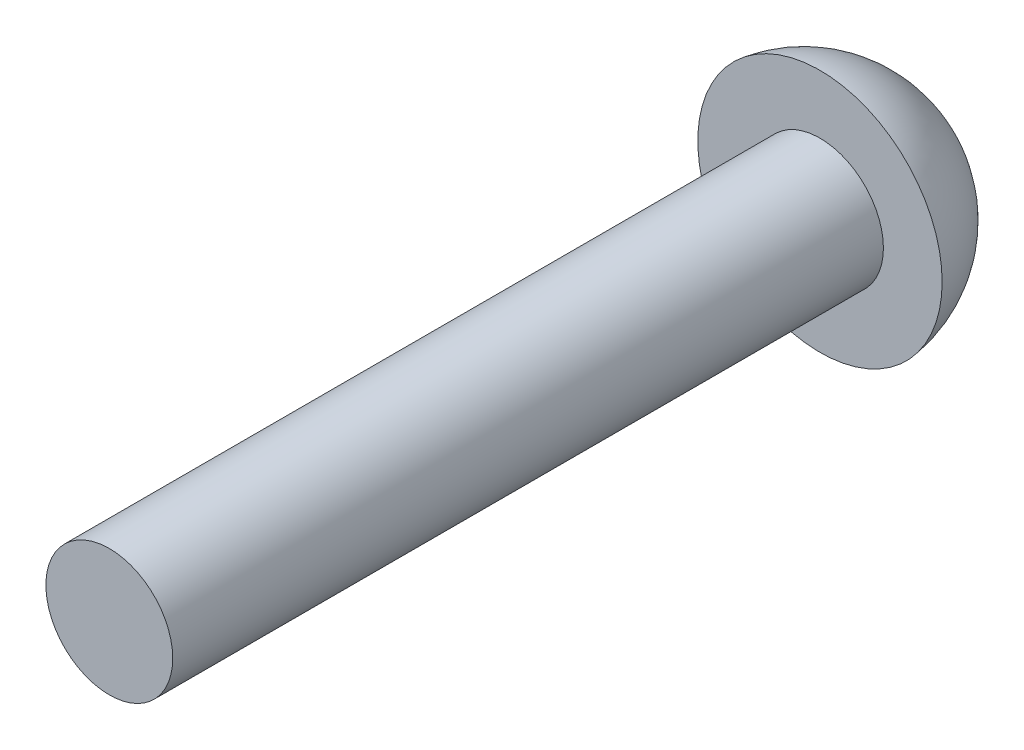
ISO-10303-21;
HEADER;
FILE_DESCRIPTION(('STEP AP214'),'2;1');
FILE_NAME('part.step','',(''),(''),'','','');
FILE_SCHEMA(('AUTOMOTIVE_DESIGN { 1 0 10303 214 1 1 1 1 }'));
ENDSEC;
DATA;
#1=APPLICATION_CONTEXT('core data for automotive mechanical design processes');
#2=APPLICATION_PROTOCOL_DEFINITION('international standard','automotive_design',2000,#1);
#3=PRODUCT_CONTEXT('',#1,'mechanical');
#4=PRODUCT('Part','Part','',(#3));
#5=PRODUCT_RELATED_PRODUCT_CATEGORY('part','',(#4));
#6=PRODUCT_DEFINITION_FORMATION('','',#4);
#7=PRODUCT_DEFINITION_CONTEXT('part definition',#1,'design');
#8=PRODUCT_DEFINITION('design','',#6,#7);
#9=PRODUCT_DEFINITION_SHAPE('','',#8);
#10=(LENGTH_UNIT() NAMED_UNIT(*) SI_UNIT(.MILLI.,.METRE.));
#11=(NAMED_UNIT(*) PLANE_ANGLE_UNIT() SI_UNIT($,.RADIAN.));
#12=(NAMED_UNIT(*) SI_UNIT($,.STERADIAN.) SOLID_ANGLE_UNIT());
#13=UNCERTAINTY_MEASURE_WITH_UNIT(LENGTH_MEASURE(1.E-05),#10,'distance_accuracy_value','');
#14=(GEOMETRIC_REPRESENTATION_CONTEXT(3) GLOBAL_UNCERTAINTY_ASSIGNED_CONTEXT((#13)) GLOBAL_UNIT_ASSIGNED_CONTEXT((#10,
#11,#12)) REPRESENTATION_CONTEXT('',''));
#15=CARTESIAN_POINT('',(0.,0.,0.));
#16=DIRECTION('',(0.,0.,1.));
#17=DIRECTION('',(1.,0.,0.));
#18=AXIS2_PLACEMENT_3D('',#15,#16,#17);
#19=CARTESIAN_POINT('',(0.,0.,0.));
#20=DIRECTION('',(0.,0.,1.));
#21=DIRECTION('',(1.,0.,0.));
#22=AXIS2_PLACEMENT_3D('',#19,#20,#21);
#23=PLANE('',#22);
#24=CARTESIAN_POINT('',(0.,0.,0.));
#25=DIRECTION('',(0.,0.,1.));
#26=DIRECTION('',(1.,0.,0.));
#27=AXIS2_PLACEMENT_3D('',#24,#25,#26);
#28=CIRCLE('',#27,1.7);
#29=CARTESIAN_POINT('',(1.7,0.,0.));
#30=VERTEX_POINT('',#29);
#31=EDGE_CURVE('E10',#30,#30,#28,.T.);
#32=ORIENTED_EDGE('',*,*,#31,.T.);
#33=EDGE_LOOP('',(#32));
#34=FACE_BOUND('',#33,.T.);
#35=ADVANCED_FACE('F31',(#34),#23,.T.);
#36=CARTESIAN_POINT('',(0.,0.,0.));
#37=DIRECTION('',(0.,0.,1.));
#38=DIRECTION('',(1.,0.,0.));
#39=AXIS2_PLACEMENT_3D('',#36,#37,#38);
#40=CYLINDRICAL_SURFACE('',#39,1.7);
#41=CARTESIAN_POINT('',(0.,0.,-19.05));
#42=DIRECTION('',(0.,0.,1.));
#43=DIRECTION('',(1.,0.,0.));
#44=AXIS2_PLACEMENT_3D('',#41,#42,#43);
#45=CIRCLE('',#44,1.7);
#46=CARTESIAN_POINT('',(1.7,0.,-19.05));
#47=VERTEX_POINT('',#46);
#48=EDGE_CURVE('E37',#47,#47,#45,.T.);
#49=ORIENTED_EDGE('',*,*,#48,.T.);
#50=EDGE_LOOP('',(#49));
#51=FACE_BOUND('',#50,.T.);
#52=ORIENTED_EDGE('',*,*,#31,.F.);
#53=EDGE_LOOP('',(#52));
#54=FACE_BOUND('',#53,.T.);
#55=ADVANCED_FACE('F57',(#51,#54),#40,.T.);
#56=CARTESIAN_POINT('',(1.7,0.,-19.05));
#57=DIRECTION('',(0.,0.,1.));
#58=DIRECTION('',(1.,0.,0.));
#59=AXIS2_PLACEMENT_3D('',#56,#57,#58);
#60=PLANE('',#59);
#61=CARTESIAN_POINT('',(0.,0.,-19.05));
#62=DIRECTION('',(0.,0.,1.));
#63=DIRECTION('',(1.,0.,0.));
#64=AXIS2_PLACEMENT_3D('',#61,#62,#63);
#65=CIRCLE('',#64,3.275);
#66=CARTESIAN_POINT('',(3.275,0.,-19.05));
#67=VERTEX_POINT('',#66);
#68=EDGE_CURVE('E41',#67,#67,#65,.T.);
#69=ORIENTED_EDGE('',*,*,#68,.T.);
#70=EDGE_LOOP('',(#69));
#71=FACE_BOUND('',#70,.T.);
#72=ORIENTED_EDGE('',*,*,#48,.F.);
#73=EDGE_LOOP('',(#72));
#74=FACE_BOUND('',#73,.T.);
#75=ADVANCED_FACE('F48',(#71,#74),#60,.T.);
#76=CARTESIAN_POINT('',(0.,0.,-18.6164242160279));
#77=DIRECTION('',(0.,0.,1.));
#78=DIRECTION('',(1.,0.,0.));
#79=AXIS2_PLACEMENT_3D('',#76,#77,#78);
#80=SPHERICAL_SURFACE('',#79,3.30357578397213);
#81=ORIENTED_EDGE('',*,*,#68,.F.);
#82=EDGE_LOOP('',(#81));
#83=FACE_BOUND('',#82,.T.);
#84=ADVANCED_FACE('F51',(#83),#80,.T.);
#85=CLOSED_SHELL('',(#35,#55,#75,#84));
#86=MANIFOLD_SOLID_BREP('B2',#85);
#87=ADVANCED_BREP_SHAPE_REPRESENTATION('',(#18,#86),#14);
#88=SHAPE_DEFINITION_REPRESENTATION(#9,#87);
ENDSEC;
END-ISO-10303-21;
